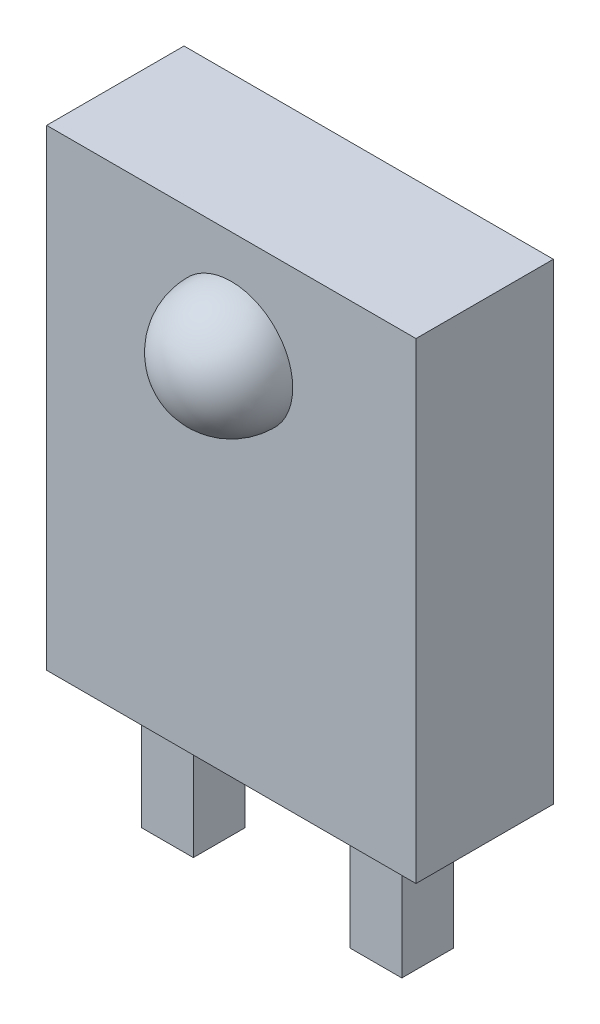
ISO-10303-21;
HEADER;
FILE_DESCRIPTION(('STEP AP214'),'2;1');
FILE_NAME('part.step','',(''),(''),'','','');
FILE_SCHEMA(('AUTOMOTIVE_DESIGN { 1 0 10303 214 1 1 1 1 }'));
ENDSEC;
DATA;
#1=APPLICATION_CONTEXT('core data for automotive mechanical design processes');
#2=APPLICATION_PROTOCOL_DEFINITION('international standard','automotive_design',2000,#1);
#3=PRODUCT_CONTEXT('',#1,'mechanical');
#4=PRODUCT('Part','Part','',(#3));
#5=PRODUCT_RELATED_PRODUCT_CATEGORY('part','',(#4));
#6=PRODUCT_DEFINITION_FORMATION('','',#4);
#7=PRODUCT_DEFINITION_CONTEXT('part definition',#1,'design');
#8=PRODUCT_DEFINITION('design','',#6,#7);
#9=PRODUCT_DEFINITION_SHAPE('','',#8);
#10=(LENGTH_UNIT() NAMED_UNIT(*) SI_UNIT(.MILLI.,.METRE.));
#11=(NAMED_UNIT(*) PLANE_ANGLE_UNIT() SI_UNIT($,.RADIAN.));
#12=(NAMED_UNIT(*) SI_UNIT($,.STERADIAN.) SOLID_ANGLE_UNIT());
#13=UNCERTAINTY_MEASURE_WITH_UNIT(LENGTH_MEASURE(1.E-05),#10,'distance_accuracy_value','');
#14=(GEOMETRIC_REPRESENTATION_CONTEXT(3) GLOBAL_UNCERTAINTY_ASSIGNED_CONTEXT((#13)) GLOBAL_UNIT_ASSIGNED_CONTEXT((#10,
#11,#12)) REPRESENTATION_CONTEXT('',''));
#15=CARTESIAN_POINT('',(0.,0.,0.));
#16=DIRECTION('',(0.,0.,1.));
#17=DIRECTION('',(1.,0.,0.));
#18=AXIS2_PLACEMENT_3D('',#15,#16,#17);
#19=CARTESIAN_POINT('',(-2.285,-2.92000000000002,1.14));
#20=DIRECTION('',(0.,1.,0.));
#21=DIRECTION('',(-1.,0.,0.));
#22=AXIS2_PLACEMENT_3D('',#19,#20,#21);
#23=PLANE('',#22);
#24=DIRECTION('',(0.,0.,-1.));
#25=VECTOR('',#24,1.);
#26=CARTESIAN_POINT('',(0.97,-2.92000000000002,0.));
#27=LINE('',#26,#25);
#28=CARTESIAN_POINT('',(0.97,-2.92000000000002,0.64));
#29=VERTEX_POINT('',#28);
#30=CARTESIAN_POINT('',(0.97,-2.92000000000002,0.));
#31=VERTEX_POINT('',#30);
#32=EDGE_CURVE('E144',#29,#31,#27,.T.);
#33=ORIENTED_EDGE('',*,*,#32,.F.);
#34=DIRECTION('',(-1.,0.,0.));
#35=VECTOR('',#34,1.);
#36=CARTESIAN_POINT('',(0.97,-2.92000000000002,0.64));
#37=LINE('',#36,#35);
#38=CARTESIAN_POINT('',(1.61,-2.92000000000002,0.64));
#39=VERTEX_POINT('',#38);
#40=EDGE_CURVE('E157',#39,#29,#37,.T.);
#41=ORIENTED_EDGE('',*,*,#40,.F.);
#42=DIRECTION('',(0.,0.,1.));
#43=VECTOR('',#42,1.);
#44=CARTESIAN_POINT('',(1.61,-2.92000000000002,0.));
#45=LINE('',#44,#43);
#46=CARTESIAN_POINT('',(1.61,-2.92000000000002,0.));
#47=VERTEX_POINT('',#46);
#48=EDGE_CURVE('E166',#47,#39,#45,.T.);
#49=ORIENTED_EDGE('',*,*,#48,.F.);
#50=DIRECTION('',(1.,0.,0.));
#51=VECTOR('',#50,1.);
#52=CARTESIAN_POINT('',(0.97,-2.92000000000002,0.));
#53=LINE('',#52,#51);
#54=EDGE_CURVE('E147',#31,#47,#53,.T.);
#55=ORIENTED_EDGE('',*,*,#54,.F.);
#56=EDGE_LOOP('',(#33,#41,#49,#55));
#57=FACE_BOUND('',#56,.T.);
#58=DIRECTION('',(0.,0.,-1.));
#59=VECTOR('',#58,1.);
#60=CARTESIAN_POINT('',(-2.285,-2.92000000000002,1.14));
#61=LINE('',#60,#59);
#62=CARTESIAN_POINT('',(-2.285,-2.92000000000002,1.14));
#63=VERTEX_POINT('',#62);
#64=CARTESIAN_POINT('',(-2.285,-2.92000000000002,-0.56));
#65=VERTEX_POINT('',#64);
#66=EDGE_CURVE('E42',#63,#65,#61,.T.);
#67=ORIENTED_EDGE('',*,*,#66,.T.);
#68=DIRECTION('',(1.,0.,0.));
#69=VECTOR('',#68,1.);
#70=CARTESIAN_POINT('',(-2.285,-2.92000000000002,-0.56));
#71=LINE('',#70,#69);
#72=CARTESIAN_POINT('',(2.285,-2.92000000000002,-0.56));
#73=VERTEX_POINT('',#72);
#74=EDGE_CURVE('E185',#65,#73,#71,.T.);
#75=ORIENTED_EDGE('',*,*,#74,.T.);
#76=DIRECTION('',(0.,0.,-1.));
#77=VECTOR('',#76,1.);
#78=CARTESIAN_POINT('',(2.285,-2.92000000000002,1.14));
#79=LINE('',#78,#77);
#80=CARTESIAN_POINT('',(2.285,-2.92000000000002,1.14));
#81=VERTEX_POINT('',#80);
#82=EDGE_CURVE('E207',#81,#73,#79,.T.);
#83=ORIENTED_EDGE('',*,*,#82,.F.);
#84=DIRECTION('',(1.,0.,0.));
#85=VECTOR('',#84,1.);
#86=CARTESIAN_POINT('',(-2.285,-2.92000000000002,1.14));
#87=LINE('',#86,#85);
#88=EDGE_CURVE('E197',#63,#81,#87,.T.);
#89=ORIENTED_EDGE('',*,*,#88,.F.);
#90=EDGE_LOOP('',(#67,#75,#83,#89));
#91=FACE_BOUND('',#90,.T.);
#92=DIRECTION('',(0.,0.,1.));
#93=VECTOR('',#92,1.);
#94=CARTESIAN_POINT('',(-0.97,-2.92000000000002,0.));
#95=LINE('',#94,#93);
#96=CARTESIAN_POINT('',(-0.97,-2.92000000000002,0.));
#97=VERTEX_POINT('',#96);
#98=CARTESIAN_POINT('',(-0.97,-2.92000000000002,0.64));
#99=VERTEX_POINT('',#98);
#100=EDGE_CURVE('E143',#97,#99,#95,.T.);
#101=ORIENTED_EDGE('',*,*,#100,.F.);
#102=DIRECTION('',(1.,0.,0.));
#103=VECTOR('',#102,1.);
#104=CARTESIAN_POINT('',(-0.97,-2.92000000000002,0.));
#105=LINE('',#104,#103);
#106=CARTESIAN_POINT('',(-1.61,-2.92000000000002,0.));
#107=VERTEX_POINT('',#106);
#108=EDGE_CURVE('E140',#107,#97,#105,.T.);
#109=ORIENTED_EDGE('',*,*,#108,.F.);
#110=DIRECTION('',(0.,0.,-1.));
#111=VECTOR('',#110,1.);
#112=CARTESIAN_POINT('',(-1.61,-2.92000000000002,0.));
#113=LINE('',#112,#111);
#114=CARTESIAN_POINT('',(-1.61,-2.92000000000002,0.64));
#115=VERTEX_POINT('',#114);
#116=EDGE_CURVE('E54',#115,#107,#113,.T.);
#117=ORIENTED_EDGE('',*,*,#116,.F.);
#118=DIRECTION('',(-1.,0.,0.));
#119=VECTOR('',#118,1.);
#120=CARTESIAN_POINT('',(-0.97,-2.92000000000002,0.64));
#121=LINE('',#120,#119);
#122=EDGE_CURVE('E49',#99,#115,#121,.T.);
#123=ORIENTED_EDGE('',*,*,#122,.F.);
#124=EDGE_LOOP('',(#101,#109,#117,#123));
#125=FACE_BOUND('',#124,.T.);
#126=ADVANCED_FACE('F34',(#57,#91,#125),#23,.F.);
#127=CARTESIAN_POINT('',(-2.285,2.91999999999998,1.14));
#128=DIRECTION('',(0.,0.,-1.));
#129=DIRECTION('',(-1.,0.,0.));
#130=AXIS2_PLACEMENT_3D('',#127,#128,#129);
#131=PLANE('',#130);
#132=DIRECTION('',(0.,-1.,0.));
#133=VECTOR('',#132,1.);
#134=CARTESIAN_POINT('',(-2.285,-2.92000000000002,1.14));
#135=LINE('',#134,#133);
#136=CARTESIAN_POINT('',(-2.285,2.91999999999998,1.14));
#137=VERTEX_POINT('',#136);
#138=EDGE_CURVE('E194',#137,#63,#135,.T.);
#139=ORIENTED_EDGE('',*,*,#138,.T.);
#140=ORIENTED_EDGE('',*,*,#88,.T.);
#141=DIRECTION('',(0.,1.,0.));
#142=VECTOR('',#141,1.);
#143=CARTESIAN_POINT('',(2.285,-2.92000000000002,1.14));
#144=LINE('',#143,#142);
#145=CARTESIAN_POINT('',(2.285,2.91999999999998,1.14));
#146=VERTEX_POINT('',#145);
#147=EDGE_CURVE('E199',#81,#146,#144,.T.);
#148=ORIENTED_EDGE('',*,*,#147,.T.);
#149=DIRECTION('',(-1.,0.,0.));
#150=VECTOR('',#149,1.);
#151=CARTESIAN_POINT('',(-2.285,2.91999999999998,1.14));
#152=LINE('',#151,#150);
#153=EDGE_CURVE('E201',#146,#137,#152,.T.);
#154=ORIENTED_EDGE('',*,*,#153,.T.);
#155=EDGE_LOOP('',(#139,#140,#148,#154));
#156=FACE_BOUND('',#155,.T.);
#157=CARTESIAN_POINT('',(0.,1.62999999999998,1.14));
#158=DIRECTION('',(0.,0.,-1.));
#159=DIRECTION('',(-1.,0.,0.));
#160=AXIS2_PLACEMENT_3D('',#157,#158,#159);
#161=CIRCLE('',#160,0.76);
#162=CARTESIAN_POINT('',(-0.76,1.62999999999998,1.14));
#163=VERTEX_POINT('',#162);
#164=EDGE_CURVE('E11',#163,#163,#161,.F.);
#165=ORIENTED_EDGE('',*,*,#164,.F.);
#166=EDGE_LOOP('',(#165));
#167=FACE_BOUND('',#166,.T.);
#168=ADVANCED_FACE('F229',(#156,#167),#131,.F.);
#169=CARTESIAN_POINT('',(-2.285,-2.92000000000002,1.14));
#170=DIRECTION('',(1.,0.,0.));
#171=DIRECTION('',(0.,0.,-1.));
#172=AXIS2_PLACEMENT_3D('',#169,#170,#171);
#173=PLANE('',#172);
#174=DIRECTION('',(0.,0.,-1.));
#175=VECTOR('',#174,1.);
#176=CARTESIAN_POINT('',(-2.285,2.91999999999998,1.14));
#177=LINE('',#176,#175);
#178=CARTESIAN_POINT('',(-2.285,2.91999999999998,-0.56));
#179=VERTEX_POINT('',#178);
#180=EDGE_CURVE('E203',#137,#179,#177,.T.);
#181=ORIENTED_EDGE('',*,*,#180,.T.);
#182=DIRECTION('',(0.,-1.,0.));
#183=VECTOR('',#182,1.);
#184=CARTESIAN_POINT('',(-2.285,-2.92000000000002,-0.56));
#185=LINE('',#184,#183);
#186=EDGE_CURVE('E182',#179,#65,#185,.T.);
#187=ORIENTED_EDGE('',*,*,#186,.T.);
#188=ORIENTED_EDGE('',*,*,#66,.F.);
#189=ORIENTED_EDGE('',*,*,#138,.F.);
#190=EDGE_LOOP('',(#181,#187,#188,#189));
#191=FACE_BOUND('',#190,.T.);
#192=ADVANCED_FACE('F219',(#191),#173,.F.);
#193=CARTESIAN_POINT('',(2.285,-2.92000000000002,1.14));
#194=DIRECTION('',(-1.,0.,0.));
#195=DIRECTION('',(0.,0.,1.));
#196=AXIS2_PLACEMENT_3D('',#193,#194,#195);
#197=PLANE('',#196);
#198=ORIENTED_EDGE('',*,*,#82,.T.);
#199=DIRECTION('',(0.,1.,0.));
#200=VECTOR('',#199,1.);
#201=CARTESIAN_POINT('',(2.285,-2.92000000000002,-0.56));
#202=LINE('',#201,#200);
#203=CARTESIAN_POINT('',(2.285,2.91999999999998,-0.56));
#204=VERTEX_POINT('',#203);
#205=EDGE_CURVE('E188',#73,#204,#202,.T.);
#206=ORIENTED_EDGE('',*,*,#205,.T.);
#207=DIRECTION('',(0.,0.,-1.));
#208=VECTOR('',#207,1.);
#209=CARTESIAN_POINT('',(2.285,2.91999999999998,1.14));
#210=LINE('',#209,#208);
#211=EDGE_CURVE('E205',#146,#204,#210,.T.);
#212=ORIENTED_EDGE('',*,*,#211,.F.);
#213=ORIENTED_EDGE('',*,*,#147,.F.);
#214=EDGE_LOOP('',(#198,#206,#212,#213));
#215=FACE_BOUND('',#214,.T.);
#216=ADVANCED_FACE('F227',(#215),#197,.F.);
#217=CARTESIAN_POINT('',(-2.285,2.91999999999998,1.14));
#218=DIRECTION('',(0.,-1.,0.));
#219=DIRECTION('',(1.,0.,0.));
#220=AXIS2_PLACEMENT_3D('',#217,#218,#219);
#221=PLANE('',#220);
#222=ORIENTED_EDGE('',*,*,#211,.T.);
#223=DIRECTION('',(-1.,0.,0.));
#224=VECTOR('',#223,1.);
#225=CARTESIAN_POINT('',(-2.285,2.91999999999998,-0.56));
#226=LINE('',#225,#224);
#227=EDGE_CURVE('E191',#204,#179,#226,.T.);
#228=ORIENTED_EDGE('',*,*,#227,.T.);
#229=ORIENTED_EDGE('',*,*,#180,.F.);
#230=ORIENTED_EDGE('',*,*,#153,.F.);
#231=EDGE_LOOP('',(#222,#228,#229,#230));
#232=FACE_BOUND('',#231,.T.);
#233=ADVANCED_FACE('F223',(#232),#221,.F.);
#234=CARTESIAN_POINT('',(-2.285,2.91999999999998,-0.56));
#235=DIRECTION('',(0.,0.,-1.));
#236=DIRECTION('',(-1.,0.,0.));
#237=AXIS2_PLACEMENT_3D('',#234,#235,#236);
#238=PLANE('',#237);
#239=ORIENTED_EDGE('',*,*,#186,.F.);
#240=ORIENTED_EDGE('',*,*,#227,.F.);
#241=ORIENTED_EDGE('',*,*,#205,.F.);
#242=ORIENTED_EDGE('',*,*,#74,.F.);
#243=EDGE_LOOP('',(#239,#240,#241,#242));
#244=FACE_BOUND('',#243,.T.);
#245=ADVANCED_FACE('F217',(#244),#238,.T.);
#246=CARTESIAN_POINT('',(0.,1.62999999999998,1.14));
#247=DIRECTION('',(0.,0.,1.));
#248=DIRECTION('',(1.,0.,0.));
#249=AXIS2_PLACEMENT_3D('',#246,#247,#248);
#250=SPHERICAL_SURFACE('',#249,0.76);
#251=ORIENTED_EDGE('',*,*,#164,.T.);
#252=EDGE_LOOP('',(#251));
#253=FACE_BOUND('',#252,.T.);
#254=ADVANCED_FACE('F36',(#253),#250,.T.);
#255=CARTESIAN_POINT('',(0.97,-4.52000000000002,0.));
#256=DIRECTION('',(1.,0.,0.));
#257=DIRECTION('',(0.,0.,-1.));
#258=AXIS2_PLACEMENT_3D('',#255,#256,#257);
#259=PLANE('',#258);
#260=ORIENTED_EDGE('',*,*,#32,.T.);
#261=DIRECTION('',(0.,1.,0.));
#262=VECTOR('',#261,1.);
#263=CARTESIAN_POINT('',(0.97,-4.52000000000002,0.));
#264=LINE('',#263,#262);
#265=CARTESIAN_POINT('',(0.97,-4.52000000000002,0.));
#266=VERTEX_POINT('',#265);
#267=EDGE_CURVE('E179',#266,#31,#264,.T.);
#268=ORIENTED_EDGE('',*,*,#267,.F.);
#269=DIRECTION('',(0.,0.,-1.));
#270=VECTOR('',#269,1.);
#271=CARTESIAN_POINT('',(0.97,-4.52000000000002,0.));
#272=LINE('',#271,#270);
#273=CARTESIAN_POINT('',(0.97,-4.52000000000002,0.64));
#274=VERTEX_POINT('',#273);
#275=EDGE_CURVE('E153',#274,#266,#272,.T.);
#276=ORIENTED_EDGE('',*,*,#275,.F.);
#277=DIRECTION('',(0.,1.,0.));
#278=VECTOR('',#277,1.);
#279=CARTESIAN_POINT('',(0.97,-4.52000000000002,0.64));
#280=LINE('',#279,#278);
#281=EDGE_CURVE('E162',#274,#29,#280,.T.);
#282=ORIENTED_EDGE('',*,*,#281,.T.);
#283=EDGE_LOOP('',(#260,#268,#276,#282));
#284=FACE_BOUND('',#283,.T.);
#285=ADVANCED_FACE('F236',(#284),#259,.F.);
#286=CARTESIAN_POINT('',(0.97,-4.52000000000002,0.));
#287=DIRECTION('',(0.,0.,1.));
#288=DIRECTION('',(1.,0.,0.));
#289=AXIS2_PLACEMENT_3D('',#286,#287,#288);
#290=PLANE('',#289);
#291=ORIENTED_EDGE('',*,*,#54,.T.);
#292=DIRECTION('',(0.,1.,0.));
#293=VECTOR('',#292,1.);
#294=CARTESIAN_POINT('',(1.61,-4.52000000000002,0.));
#295=LINE('',#294,#293);
#296=CARTESIAN_POINT('',(1.61,-4.52000000000002,0.));
#297=VERTEX_POINT('',#296);
#298=EDGE_CURVE('E176',#297,#47,#295,.T.);
#299=ORIENTED_EDGE('',*,*,#298,.F.);
#300=DIRECTION('',(1.,0.,0.));
#301=VECTOR('',#300,1.);
#302=CARTESIAN_POINT('',(0.97,-4.52000000000002,0.));
#303=LINE('',#302,#301);
#304=EDGE_CURVE('E156',#266,#297,#303,.T.);
#305=ORIENTED_EDGE('',*,*,#304,.F.);
#306=ORIENTED_EDGE('',*,*,#267,.T.);
#307=EDGE_LOOP('',(#291,#299,#305,#306));
#308=FACE_BOUND('',#307,.T.);
#309=ADVANCED_FACE('F241',(#308),#290,.F.);
#310=CARTESIAN_POINT('',(1.61,-4.52000000000002,0.));
#311=DIRECTION('',(-1.,0.,0.));
#312=DIRECTION('',(0.,-1.,0.));
#313=AXIS2_PLACEMENT_3D('',#310,#311,#312);
#314=PLANE('',#313);
#315=ORIENTED_EDGE('',*,*,#48,.T.);
#316=DIRECTION('',(0.,1.,0.));
#317=VECTOR('',#316,1.);
#318=CARTESIAN_POINT('',(1.61,-4.52000000000002,0.64));
#319=LINE('',#318,#317);
#320=CARTESIAN_POINT('',(1.61,-4.52000000000002,0.64));
#321=VERTEX_POINT('',#320);
#322=EDGE_CURVE('E173',#321,#39,#319,.T.);
#323=ORIENTED_EDGE('',*,*,#322,.F.);
#324=DIRECTION('',(0.,0.,1.));
#325=VECTOR('',#324,1.);
#326=CARTESIAN_POINT('',(1.61,-4.52000000000002,0.));
#327=LINE('',#326,#325);
#328=EDGE_CURVE('E159',#297,#321,#327,.T.);
#329=ORIENTED_EDGE('',*,*,#328,.F.);
#330=ORIENTED_EDGE('',*,*,#298,.T.);
#331=EDGE_LOOP('',(#315,#323,#329,#330));
#332=FACE_BOUND('',#331,.T.);
#333=ADVANCED_FACE('F264',(#332),#314,.F.);
#334=CARTESIAN_POINT('',(0.97,-4.52000000000002,0.64));
#335=DIRECTION('',(0.,0.,-1.));
#336=DIRECTION('',(-1.,0.,0.));
#337=AXIS2_PLACEMENT_3D('',#334,#335,#336);
#338=PLANE('',#337);
#339=ORIENTED_EDGE('',*,*,#40,.T.);
#340=ORIENTED_EDGE('',*,*,#281,.F.);
#341=DIRECTION('',(-1.,0.,0.));
#342=VECTOR('',#341,1.);
#343=CARTESIAN_POINT('',(0.97,-4.52000000000002,0.64));
#344=LINE('',#343,#342);
#345=EDGE_CURVE('E161',#321,#274,#344,.T.);
#346=ORIENTED_EDGE('',*,*,#345,.F.);
#347=ORIENTED_EDGE('',*,*,#322,.T.);
#348=EDGE_LOOP('',(#339,#340,#346,#347));
#349=FACE_BOUND('',#348,.T.);
#350=ADVANCED_FACE('F268',(#349),#338,.F.);
#351=CARTESIAN_POINT('',(0.97,-4.52000000000002,0.64));
#352=DIRECTION('',(0.,1.,0.));
#353=DIRECTION('',(0.,0.,1.));
#354=AXIS2_PLACEMENT_3D('',#351,#352,#353);
#355=PLANE('',#354);
#356=ORIENTED_EDGE('',*,*,#275,.T.);
#357=ORIENTED_EDGE('',*,*,#304,.T.);
#358=ORIENTED_EDGE('',*,*,#328,.T.);
#359=ORIENTED_EDGE('',*,*,#345,.T.);
#360=EDGE_LOOP('',(#356,#357,#358,#359));
#361=FACE_BOUND('',#360,.T.);
#362=ADVANCED_FACE('F272',(#361),#355,.F.);
#363=CARTESIAN_POINT('',(-0.97,-4.52000000000002,0.));
#364=DIRECTION('',(-1.,0.,0.));
#365=DIRECTION('',(0.,0.,1.));
#366=AXIS2_PLACEMENT_3D('',#363,#364,#365);
#367=PLANE('',#366);
#368=ORIENTED_EDGE('',*,*,#100,.T.);
#369=DIRECTION('',(0.,1.,0.));
#370=VECTOR('',#369,1.);
#371=CARTESIAN_POINT('',(-0.97,-4.52000000000002,0.64));
#372=LINE('',#371,#370);
#373=CARTESIAN_POINT('',(-0.97,-4.52000000000002,0.64));
#374=VERTEX_POINT('',#373);
#375=EDGE_CURVE('E124',#374,#99,#372,.T.);
#376=ORIENTED_EDGE('',*,*,#375,.F.);
#377=DIRECTION('',(0.,0.,1.));
#378=VECTOR('',#377,1.);
#379=CARTESIAN_POINT('',(-0.97,-4.52000000000002,0.));
#380=LINE('',#379,#378);
#381=CARTESIAN_POINT('',(-0.97,-4.52000000000002,0.));
#382=VERTEX_POINT('',#381);
#383=EDGE_CURVE('E131',#382,#374,#380,.T.);
#384=ORIENTED_EDGE('',*,*,#383,.F.);
#385=DIRECTION('',(0.,1.,0.));
#386=VECTOR('',#385,1.);
#387=CARTESIAN_POINT('',(-0.97,-4.52000000000002,0.));
#388=LINE('',#387,#386);
#389=EDGE_CURVE('E390',#382,#97,#388,.T.);
#390=ORIENTED_EDGE('',*,*,#389,.T.);
#391=EDGE_LOOP('',(#368,#376,#384,#390));
#392=FACE_BOUND('',#391,.T.);
#393=ADVANCED_FACE('F142',(#392),#367,.F.);
#394=CARTESIAN_POINT('',(-0.97,-4.52000000000002,0.64));
#395=DIRECTION('',(0.,0.,-1.));
#396=DIRECTION('',(-1.,0.,0.));
#397=AXIS2_PLACEMENT_3D('',#394,#395,#396);
#398=PLANE('',#397);
#399=ORIENTED_EDGE('',*,*,#122,.T.);
#400=DIRECTION('',(0.,1.,0.));
#401=VECTOR('',#400,1.);
#402=CARTESIAN_POINT('',(-1.61,-4.52000000000002,0.64));
#403=LINE('',#402,#401);
#404=CARTESIAN_POINT('',(-1.61,-4.52000000000002,0.64));
#405=VERTEX_POINT('',#404);
#406=EDGE_CURVE('E127',#405,#115,#403,.T.);
#407=ORIENTED_EDGE('',*,*,#406,.F.);
#408=DIRECTION('',(-1.,0.,0.));
#409=VECTOR('',#408,1.);
#410=CARTESIAN_POINT('',(-0.97,-4.52000000000002,0.64));
#411=LINE('',#410,#409);
#412=EDGE_CURVE('E120',#374,#405,#411,.T.);
#413=ORIENTED_EDGE('',*,*,#412,.F.);
#414=ORIENTED_EDGE('',*,*,#375,.T.);
#415=EDGE_LOOP('',(#399,#407,#413,#414));
#416=FACE_BOUND('',#415,.T.);
#417=ADVANCED_FACE('F122',(#416),#398,.F.);
#418=CARTESIAN_POINT('',(-1.61,-4.52000000000002,0.));
#419=DIRECTION('',(1.,0.,0.));
#420=DIRECTION('',(0.,1.,0.));
#421=AXIS2_PLACEMENT_3D('',#418,#419,#420);
#422=PLANE('',#421);
#423=ORIENTED_EDGE('',*,*,#116,.T.);
#424=DIRECTION('',(0.,1.,0.));
#425=VECTOR('',#424,1.);
#426=CARTESIAN_POINT('',(-1.61,-4.52000000000002,0.));
#427=LINE('',#426,#425);
#428=CARTESIAN_POINT('',(-1.61,-4.52000000000002,0.));
#429=VERTEX_POINT('',#428);
#430=EDGE_CURVE('E149',#429,#107,#427,.T.);
#431=ORIENTED_EDGE('',*,*,#430,.F.);
#432=DIRECTION('',(0.,0.,-1.));
#433=VECTOR('',#432,1.);
#434=CARTESIAN_POINT('',(-1.61,-4.52000000000002,0.));
#435=LINE('',#434,#433);
#436=EDGE_CURVE('E130',#405,#429,#435,.T.);
#437=ORIENTED_EDGE('',*,*,#436,.F.);
#438=ORIENTED_EDGE('',*,*,#406,.T.);
#439=EDGE_LOOP('',(#423,#431,#437,#438));
#440=FACE_BOUND('',#439,.T.);
#441=ADVANCED_FACE('F281',(#440),#422,.F.);
#442=CARTESIAN_POINT('',(-0.97,-4.52000000000002,0.));
#443=DIRECTION('',(0.,0.,1.));
#444=DIRECTION('',(1.,0.,0.));
#445=AXIS2_PLACEMENT_3D('',#442,#443,#444);
#446=PLANE('',#445);
#447=ORIENTED_EDGE('',*,*,#108,.T.);
#448=ORIENTED_EDGE('',*,*,#389,.F.);
#449=DIRECTION('',(1.,0.,0.));
#450=VECTOR('',#449,1.);
#451=CARTESIAN_POINT('',(-0.97,-4.52000000000002,0.));
#452=LINE('',#451,#450);
#453=EDGE_CURVE('E136',#429,#382,#452,.T.);
#454=ORIENTED_EDGE('',*,*,#453,.F.);
#455=ORIENTED_EDGE('',*,*,#430,.T.);
#456=EDGE_LOOP('',(#447,#448,#454,#455));
#457=FACE_BOUND('',#456,.T.);
#458=ADVANCED_FACE('F284',(#457),#446,.F.);
#459=CARTESIAN_POINT('',(-0.97,-4.52000000000002,0.64));
#460=DIRECTION('',(0.,-1.,0.));
#461=DIRECTION('',(0.,0.,-1.));
#462=AXIS2_PLACEMENT_3D('',#459,#460,#461);
#463=PLANE('',#462);
#464=ORIENTED_EDGE('',*,*,#383,.T.);
#465=ORIENTED_EDGE('',*,*,#412,.T.);
#466=ORIENTED_EDGE('',*,*,#436,.T.);
#467=ORIENTED_EDGE('',*,*,#453,.T.);
#468=EDGE_LOOP('',(#464,#465,#466,#467));
#469=FACE_BOUND('',#468,.T.);
#470=ADVANCED_FACE('F134',(#469),#463,.T.);
#471=CLOSED_SHELL('',(#126,#168,#192,#216,#233,#245,#254,#285,#309,#333,#350,#362,#393,#417,
#441,#458,#470));
#472=MANIFOLD_SOLID_BREP('B2',#471);
#473=ADVANCED_BREP_SHAPE_REPRESENTATION('',(#18,#472),#14);
#474=SHAPE_DEFINITION_REPRESENTATION(#9,#473);
ENDSEC;
END-ISO-10303-21;
